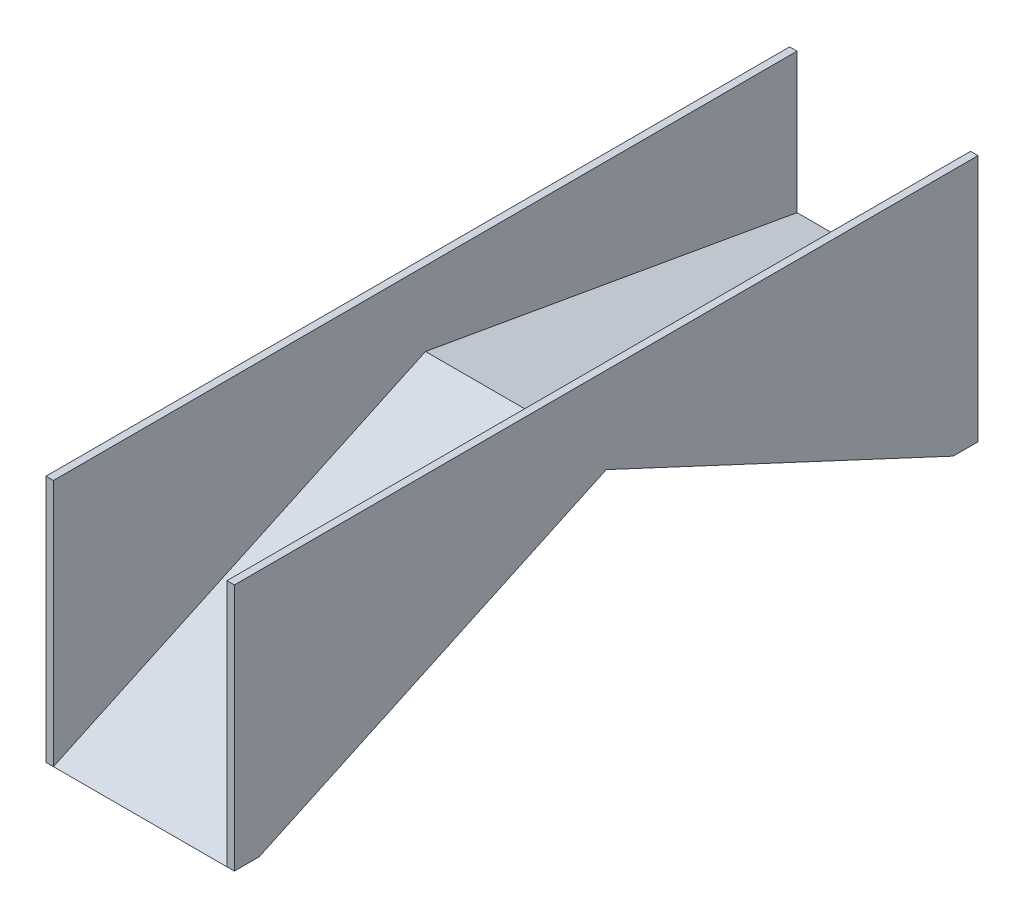
ISO-10303-21;
HEADER;
FILE_DESCRIPTION(('STEP AP214'),'2;1');
FILE_NAME('part.step','',(''),(''),'','','');
FILE_SCHEMA(('AUTOMOTIVE_DESIGN { 1 0 10303 214 1 1 1 1 }'));
ENDSEC;
DATA;
#1=APPLICATION_CONTEXT('core data for automotive mechanical design processes');
#2=APPLICATION_PROTOCOL_DEFINITION('international standard','automotive_design',2000,#1);
#3=PRODUCT_CONTEXT('',#1,'mechanical');
#4=PRODUCT('Part','Part','',(#3));
#5=PRODUCT_RELATED_PRODUCT_CATEGORY('part','',(#4));
#6=PRODUCT_DEFINITION_FORMATION('','',#4);
#7=PRODUCT_DEFINITION_CONTEXT('part definition',#1,'design');
#8=PRODUCT_DEFINITION('design','',#6,#7);
#9=PRODUCT_DEFINITION_SHAPE('','',#8);
#10=(LENGTH_UNIT() NAMED_UNIT(*) SI_UNIT(.MILLI.,.METRE.));
#11=(NAMED_UNIT(*) PLANE_ANGLE_UNIT() SI_UNIT($,.RADIAN.));
#12=(NAMED_UNIT(*) SI_UNIT($,.STERADIAN.) SOLID_ANGLE_UNIT());
#13=UNCERTAINTY_MEASURE_WITH_UNIT(LENGTH_MEASURE(1.E-05),#10,'distance_accuracy_value','');
#14=(GEOMETRIC_REPRESENTATION_CONTEXT(3) GLOBAL_UNCERTAINTY_ASSIGNED_CONTEXT((#13)) GLOBAL_UNIT_ASSIGNED_CONTEXT((#10,
#11,#12)) REPRESENTATION_CONTEXT('',''));
#15=CARTESIAN_POINT('',(0.,0.,0.));
#16=DIRECTION('',(0.,0.,1.));
#17=DIRECTION('',(1.,0.,0.));
#18=AXIS2_PLACEMENT_3D('',#15,#16,#17);
#19=CARTESIAN_POINT('',(0.,0.,0.));
#20=DIRECTION('',(0.,1.,0.));
#21=DIRECTION('',(0.,0.,1.));
#22=AXIS2_PLACEMENT_3D('',#19,#20,#21);
#23=PLANE('',#22);
#24=DIRECTION('',(0.,0.,1.));
#25=VECTOR('',#24,1.);
#26=CARTESIAN_POINT('',(-49.7317762400161,0.,0.));
#27=LINE('',#26,#25);
#28=CARTESIAN_POINT('',(-49.7317762400161,0.,151.723954719059));
#29=VERTEX_POINT('',#28);
#30=CARTESIAN_POINT('',(-49.731776240016,0.,161.723954719059));
#31=VERTEX_POINT('',#30);
#32=EDGE_CURVE('E234',#29,#31,#27,.T.);
#33=ORIENTED_EDGE('',*,*,#32,.F.);
#34=DIRECTION('',(1.,0.,0.));
#35=VECTOR('',#34,1.);
#36=CARTESIAN_POINT('',(-49.7317762400161,0.,151.723954719059));
#37=LINE('',#36,#35);
#38=CARTESIAN_POINT('',(26.2682237599839,0.,151.723954719059));
#39=VERTEX_POINT('',#38);
#40=EDGE_CURVE('E181',#29,#39,#37,.T.);
#41=ORIENTED_EDGE('',*,*,#40,.T.);
#42=DIRECTION('',(0.,0.,-1.));
#43=VECTOR('',#42,1.);
#44=CARTESIAN_POINT('',(26.2682237599839,0.,0.));
#45=LINE('',#44,#43);
#46=CARTESIAN_POINT('',(26.2682237599839,0.,161.723954719059));
#47=VERTEX_POINT('',#46);
#48=EDGE_CURVE('E214',#47,#39,#45,.T.);
#49=ORIENTED_EDGE('',*,*,#48,.F.);
#50=DIRECTION('',(1.,0.,0.));
#51=VECTOR('',#50,1.);
#52=CARTESIAN_POINT('',(0.,0.,161.723954719059));
#53=LINE('',#52,#51);
#54=CARTESIAN_POINT('',(23.2682237599839,0.,161.723954719059));
#55=VERTEX_POINT('',#54);
#56=EDGE_CURVE('E258',#55,#47,#53,.T.);
#57=ORIENTED_EDGE('',*,*,#56,.F.);
#58=DIRECTION('',(-1.,0.,0.));
#59=VECTOR('',#58,1.);
#60=CARTESIAN_POINT('',(188.902334580659,0.,161.723954719059));
#61=LINE('',#60,#59);
#62=CARTESIAN_POINT('',(-46.731776240016,0.,161.723954719059));
#63=VERTEX_POINT('',#62);
#64=EDGE_CURVE('E202',#55,#63,#61,.T.);
#65=ORIENTED_EDGE('',*,*,#64,.T.);
#66=EDGE_CURVE('E259',#31,#63,#53,.T.);
#67=ORIENTED_EDGE('',*,*,#66,.F.);
#68=EDGE_LOOP('',(#33,#41,#49,#57,#65,#67));
#69=FACE_BOUND('',#68,.T.);
#70=ADVANCED_FACE('F39',(#69),#23,.F.);
#71=CARTESIAN_POINT('',(0.,70.,-138.276045280941));
#72=DIRECTION('',(0.,0.,-1.));
#73=DIRECTION('',(-1.,0.,0.));
#74=AXIS2_PLACEMENT_3D('',#71,#72,#73);
#75=PLANE('',#74);
#76=DIRECTION('',(0.,-1.,0.));
#77=VECTOR('',#76,1.);
#78=CARTESIAN_POINT('',(-46.7317762400161,100.,-138.276045280941));
#79=LINE('',#78,#77);
#80=CARTESIAN_POINT('',(-46.7317762400161,100.,-138.276045280941));
#81=VERTEX_POINT('',#80);
#82=CARTESIAN_POINT('',(-46.7317762400161,43.5713159155916,-138.276045280941));
#83=VERTEX_POINT('',#82);
#84=EDGE_CURVE('E246',#81,#83,#79,.T.);
#85=ORIENTED_EDGE('',*,*,#84,.T.);
#86=DIRECTION('',(-1.,0.,0.));
#87=VECTOR('',#86,1.);
#88=CARTESIAN_POINT('',(175.464949573609,43.5713159155916,-138.276045280941));
#89=LINE('',#88,#87);
#90=CARTESIAN_POINT('',(23.2682237599839,43.5713159155916,-138.276045280941));
#91=VERTEX_POINT('',#90);
#92=EDGE_CURVE('E194',#91,#83,#89,.T.);
#93=ORIENTED_EDGE('',*,*,#92,.F.);
#94=DIRECTION('',(0.,-1.,0.));
#95=VECTOR('',#94,1.);
#96=CARTESIAN_POINT('',(23.2682237599839,100.,-138.276045280941));
#97=LINE('',#96,#95);
#98=CARTESIAN_POINT('',(23.2682237599839,100.,-138.276045280941));
#99=VERTEX_POINT('',#98);
#100=EDGE_CURVE('E226',#99,#91,#97,.T.);
#101=ORIENTED_EDGE('',*,*,#100,.F.);
#102=DIRECTION('',(1.,0.,0.));
#103=VECTOR('',#102,1.);
#104=CARTESIAN_POINT('',(0.,100.,-138.276045280941));
#105=LINE('',#104,#103);
#106=CARTESIAN_POINT('',(26.2682237599839,100.,-138.276045280941));
#107=VERTEX_POINT('',#106);
#108=EDGE_CURVE('E216',#99,#107,#105,.T.);
#109=ORIENTED_EDGE('',*,*,#108,.T.);
#110=DIRECTION('',(0.,-1.,0.));
#111=VECTOR('',#110,1.);
#112=CARTESIAN_POINT('',(26.2682237599839,100.,-138.276045280941));
#113=LINE('',#112,#111);
#114=CARTESIAN_POINT('',(26.2682237599839,0.,-138.276045280941));
#115=VERTEX_POINT('',#114);
#116=EDGE_CURVE('E228',#107,#115,#113,.T.);
#117=ORIENTED_EDGE('',*,*,#116,.T.);
#118=DIRECTION('',(1.,0.,0.));
#119=VECTOR('',#118,1.);
#120=CARTESIAN_POINT('',(0.,0.,-138.276045280941));
#121=LINE('',#120,#119);
#122=CARTESIAN_POINT('',(-49.7317762400161,0.,-138.276045280941));
#123=VERTEX_POINT('',#122);
#124=EDGE_CURVE('E262',#123,#115,#121,.T.);
#125=ORIENTED_EDGE('',*,*,#124,.F.);
#126=DIRECTION('',(0.,-1.,0.));
#127=VECTOR('',#126,1.);
#128=CARTESIAN_POINT('',(-49.7317762400161,100.,-138.276045280941));
#129=LINE('',#128,#127);
#130=CARTESIAN_POINT('',(-49.7317762400161,100.,-138.276045280941));
#131=VERTEX_POINT('',#130);
#132=EDGE_CURVE('E255',#131,#123,#129,.T.);
#133=ORIENTED_EDGE('',*,*,#132,.F.);
#134=DIRECTION('',(-1.,0.,0.));
#135=VECTOR('',#134,1.);
#136=CARTESIAN_POINT('',(0.,100.,-138.276045280941));
#137=LINE('',#136,#135);
#138=EDGE_CURVE('E235',#81,#131,#137,.T.);
#139=ORIENTED_EDGE('',*,*,#138,.F.);
#140=EDGE_LOOP('',(#85,#93,#101,#109,#117,#125,#133,#139));
#141=FACE_BOUND('',#140,.T.);
#142=ADVANCED_FACE('F286',(#141),#75,.T.);
#143=CARTESIAN_POINT('',(0.,70.,161.723954719059));
#144=DIRECTION('',(0.,0.,-1.));
#145=DIRECTION('',(-1.,0.,0.));
#146=AXIS2_PLACEMENT_3D('',#143,#144,#145);
#147=PLANE('',#146);
#148=DIRECTION('',(0.,-1.,0.));
#149=VECTOR('',#148,1.);
#150=CARTESIAN_POINT('',(23.2682237599839,100.,161.723954719059));
#151=LINE('',#150,#149);
#152=CARTESIAN_POINT('',(23.2682237599839,100.,161.723954719059));
#153=VERTEX_POINT('',#152);
#154=EDGE_CURVE('E222',#153,#55,#151,.T.);
#155=ORIENTED_EDGE('',*,*,#154,.T.);
#156=ORIENTED_EDGE('',*,*,#56,.T.);
#157=DIRECTION('',(0.,-1.,0.));
#158=VECTOR('',#157,1.);
#159=CARTESIAN_POINT('',(26.2682237599839,100.,161.723954719059));
#160=LINE('',#159,#158);
#161=CARTESIAN_POINT('',(26.2682237599839,100.,161.723954719059));
#162=VERTEX_POINT('',#161);
#163=EDGE_CURVE('E231',#162,#47,#160,.T.);
#164=ORIENTED_EDGE('',*,*,#163,.F.);
#165=DIRECTION('',(1.,0.,0.));
#166=VECTOR('',#165,1.);
#167=CARTESIAN_POINT('',(0.,100.,161.723954719059));
#168=LINE('',#167,#166);
#169=EDGE_CURVE('E210',#153,#162,#168,.T.);
#170=ORIENTED_EDGE('',*,*,#169,.F.);
#171=EDGE_LOOP('',(#155,#156,#164,#170));
#172=FACE_BOUND('',#171,.T.);
#173=ADVANCED_FACE('F300',(#172),#147,.F.);
#174=ORIENTED_EDGE('',*,*,#66,.T.);
#175=DIRECTION('',(0.,-1.,0.));
#176=VECTOR('',#175,1.);
#177=CARTESIAN_POINT('',(-46.731776240016,100.,161.723954719059));
#178=LINE('',#177,#176);
#179=CARTESIAN_POINT('',(-46.731776240016,100.,161.723954719059));
#180=VERTEX_POINT('',#179);
#181=EDGE_CURVE('E250',#180,#63,#178,.T.);
#182=ORIENTED_EDGE('',*,*,#181,.F.);
#183=DIRECTION('',(-1.,0.,0.));
#184=VECTOR('',#183,1.);
#185=CARTESIAN_POINT('',(0.,100.,161.723954719059));
#186=LINE('',#185,#184);
#187=CARTESIAN_POINT('',(-49.731776240016,100.,161.723954719059));
#188=VERTEX_POINT('',#187);
#189=EDGE_CURVE('E241',#180,#188,#186,.T.);
#190=ORIENTED_EDGE('',*,*,#189,.T.);
#191=DIRECTION('',(0.,-1.,0.));
#192=VECTOR('',#191,1.);
#193=CARTESIAN_POINT('',(-49.731776240016,100.,161.723954719059));
#194=LINE('',#193,#192);
#195=EDGE_CURVE('E252',#188,#31,#194,.T.);
#196=ORIENTED_EDGE('',*,*,#195,.T.);
#197=EDGE_LOOP('',(#174,#182,#190,#196));
#198=FACE_BOUND('',#197,.T.);
#199=ADVANCED_FACE('F41',(#198),#147,.F.);
#200=CARTESIAN_POINT('',(26.2682237599839,0.,-128.276045280941));
#201=VERTEX_POINT('',#200);
#202=EDGE_CURVE('E201',#201,#115,#45,.T.);
#203=ORIENTED_EDGE('',*,*,#202,.F.);
#204=DIRECTION('',(1.,0.,0.));
#205=VECTOR('',#204,1.);
#206=CARTESIAN_POINT('',(-49.7317762400161,0.,-128.276045280941));
#207=LINE('',#206,#205);
#208=CARTESIAN_POINT('',(13.2682237599839,0.,-128.276045280941));
#209=VERTEX_POINT('',#208);
#210=EDGE_CURVE('E62',#209,#201,#207,.T.);
#211=ORIENTED_EDGE('',*,*,#210,.F.);
#212=DIRECTION('',(1.,0.,0.));
#213=VECTOR('',#212,1.);
#214=CARTESIAN_POINT('',(-36.7317762400161,0.,-128.276045280941));
#215=LINE('',#214,#213);
#216=CARTESIAN_POINT('',(-36.7317762400161,0.,-128.276045280941));
#217=VERTEX_POINT('',#216);
#218=EDGE_CURVE('E157',#217,#209,#215,.T.);
#219=ORIENTED_EDGE('',*,*,#218,.F.);
#220=CARTESIAN_POINT('',(-49.7317762400161,0.,-128.276045280941));
#221=VERTEX_POINT('',#220);
#222=EDGE_CURVE('E187',#221,#217,#207,.T.);
#223=ORIENTED_EDGE('',*,*,#222,.F.);
#224=EDGE_CURVE('E239',#123,#221,#27,.T.);
#225=ORIENTED_EDGE('',*,*,#224,.F.);
#226=ORIENTED_EDGE('',*,*,#124,.T.);
#227=EDGE_LOOP('',(#203,#211,#219,#223,#225,#226));
#228=FACE_BOUND('',#227,.T.);
#229=ADVANCED_FACE('F269',(#228),#23,.F.);
#230=CARTESIAN_POINT('',(-46.731776240016,100.,0.));
#231=DIRECTION('',(-1.,0.,0.));
#232=DIRECTION('',(0.,0.,1.));
#233=AXIS2_PLACEMENT_3D('',#230,#231,#232);
#234=PLANE('',#233);
#235=ORIENTED_EDGE('',*,*,#181,.T.);
#236=DIRECTION('',(0.,-0.4226182617407,0.90630778703665));
#237=VECTOR('',#236,1.);
#238=CARTESIAN_POINT('',(-46.731776240016,61.9438684158803,28.8849002180706));
#239=LINE('',#238,#237);
#240=CARTESIAN_POINT('',(-46.731776240016,70.,11.6084702833903));
#241=VERTEX_POINT('',#240);
#242=EDGE_CURVE('E193',#241,#63,#239,.T.);
#243=ORIENTED_EDGE('',*,*,#242,.F.);
#244=DIRECTION('',(0.,0.173648177666924,0.984807753012209));
#245=VECTOR('',#244,1.);
#246=CARTESIAN_POINT('',(-46.7317762400161,43.5713159155916,-138.276045280941));
#247=LINE('',#246,#245);
#248=EDGE_CURVE('E184',#83,#241,#247,.T.);
#249=ORIENTED_EDGE('',*,*,#248,.F.);
#250=ORIENTED_EDGE('',*,*,#84,.F.);
#251=DIRECTION('',(0.,0.,-1.));
#252=VECTOR('',#251,1.);
#253=CARTESIAN_POINT('',(-46.731776240016,100.,0.));
#254=LINE('',#253,#252);
#255=EDGE_CURVE('E244',#180,#81,#254,.T.);
#256=ORIENTED_EDGE('',*,*,#255,.F.);
#257=EDGE_LOOP('',(#235,#243,#249,#250,#256));
#258=FACE_BOUND('',#257,.T.);
#259=ADVANCED_FACE('F312',(#258),#234,.F.);
#260=CARTESIAN_POINT('',(-49.7317762400161,100.,0.));
#261=DIRECTION('',(1.,0.,0.));
#262=DIRECTION('',(0.,0.,-1.));
#263=AXIS2_PLACEMENT_3D('',#260,#261,#262);
#264=PLANE('',#263);
#265=DIRECTION('',(0.,0.422618261740701,0.906307787036649));
#266=VECTOR('',#265,1.);
#267=CARTESIAN_POINT('',(-49.7317762400161,65.2830721417001,11.723954719059));
#268=LINE('',#267,#266);
#269=CARTESIAN_POINT('',(-49.7317762400161,65.2830721417001,11.723954719059));
#270=VERTEX_POINT('',#269);
#271=EDGE_CURVE('E172',#221,#270,#268,.T.);
#272=ORIENTED_EDGE('',*,*,#271,.T.);
#273=DIRECTION('',(0.,-0.422618261740701,0.906307787036649));
#274=VECTOR('',#273,1.);
#275=CARTESIAN_POINT('',(-49.7317762400161,0.,151.723954719059));
#276=LINE('',#275,#274);
#277=EDGE_CURVE('E175',#270,#29,#276,.T.);
#278=ORIENTED_EDGE('',*,*,#277,.T.);
#279=ORIENTED_EDGE('',*,*,#32,.T.);
#280=ORIENTED_EDGE('',*,*,#195,.F.);
#281=DIRECTION('',(0.,0.,1.));
#282=VECTOR('',#281,1.);
#283=CARTESIAN_POINT('',(-49.7317762400161,100.,0.));
#284=LINE('',#283,#282);
#285=EDGE_CURVE('E238',#131,#188,#284,.T.);
#286=ORIENTED_EDGE('',*,*,#285,.F.);
#287=ORIENTED_EDGE('',*,*,#132,.T.);
#288=ORIENTED_EDGE('',*,*,#224,.T.);
#289=EDGE_LOOP('',(#272,#278,#279,#280,#286,#287,#288));
#290=FACE_BOUND('',#289,.T.);
#291=ADVANCED_FACE('F281',(#290),#264,.F.);
#292=CARTESIAN_POINT('',(0.,100.,0.));
#293=DIRECTION('',(0.,1.,0.));
#294=DIRECTION('',(0.,0.,1.));
#295=AXIS2_PLACEMENT_3D('',#292,#293,#294);
#296=PLANE('',#295);
#297=ORIENTED_EDGE('',*,*,#138,.T.);
#298=ORIENTED_EDGE('',*,*,#285,.T.);
#299=ORIENTED_EDGE('',*,*,#189,.F.);
#300=ORIENTED_EDGE('',*,*,#255,.T.);
#301=EDGE_LOOP('',(#297,#298,#299,#300));
#302=FACE_BOUND('',#301,.T.);
#303=ADVANCED_FACE('F308',(#302),#296,.T.);
#304=CARTESIAN_POINT('',(23.2682237599839,100.,0.));
#305=DIRECTION('',(-1.,0.,0.));
#306=DIRECTION('',(0.,0.,1.));
#307=AXIS2_PLACEMENT_3D('',#304,#305,#306);
#308=PLANE('',#307);
#309=ORIENTED_EDGE('',*,*,#100,.T.);
#310=DIRECTION('',(0.,-0.173648177666924,-0.984807753012209));
#311=VECTOR('',#310,1.);
#312=CARTESIAN_POINT('',(23.2682237599839,43.5713159155916,-138.276045280941));
#313=LINE('',#312,#311);
#314=CARTESIAN_POINT('',(23.2682237599839,70.,11.6084702833902));
#315=VERTEX_POINT('',#314);
#316=EDGE_CURVE('E190',#315,#91,#313,.T.);
#317=ORIENTED_EDGE('',*,*,#316,.F.);
#318=DIRECTION('',(0.,0.4226182617407,-0.90630778703665));
#319=VECTOR('',#318,1.);
#320=CARTESIAN_POINT('',(23.2682237599839,61.9438684158803,28.8849002180706));
#321=LINE('',#320,#319);
#322=EDGE_CURVE('E198',#55,#315,#321,.T.);
#323=ORIENTED_EDGE('',*,*,#322,.F.);
#324=ORIENTED_EDGE('',*,*,#154,.F.);
#325=DIRECTION('',(0.,0.,-1.));
#326=VECTOR('',#325,1.);
#327=CARTESIAN_POINT('',(23.2682237599839,100.,0.));
#328=LINE('',#327,#326);
#329=EDGE_CURVE('E219',#153,#99,#328,.T.);
#330=ORIENTED_EDGE('',*,*,#329,.T.);
#331=EDGE_LOOP('',(#309,#317,#323,#324,#330));
#332=FACE_BOUND('',#331,.T.);
#333=ADVANCED_FACE('F293',(#332),#308,.T.);
#334=CARTESIAN_POINT('',(26.2682237599839,100.,0.));
#335=DIRECTION('',(-1.,0.,0.));
#336=DIRECTION('',(0.,0.,1.));
#337=AXIS2_PLACEMENT_3D('',#334,#335,#336);
#338=PLANE('',#337);
#339=ORIENTED_EDGE('',*,*,#48,.T.);
#340=DIRECTION('',(0.,-0.422618261740701,0.906307787036649));
#341=VECTOR('',#340,1.);
#342=CARTESIAN_POINT('',(26.2682237599839,0.,151.723954719059));
#343=LINE('',#342,#341);
#344=CARTESIAN_POINT('',(26.2682237599839,65.2830721417001,11.723954719059));
#345=VERTEX_POINT('',#344);
#346=EDGE_CURVE('E176',#345,#39,#343,.T.);
#347=ORIENTED_EDGE('',*,*,#346,.F.);
#348=DIRECTION('',(0.,0.422618261740701,0.906307787036649));
#349=VECTOR('',#348,1.);
#350=CARTESIAN_POINT('',(26.2682237599839,65.2830721417001,11.723954719059));
#351=LINE('',#350,#349);
#352=EDGE_CURVE('E170',#201,#345,#351,.T.);
#353=ORIENTED_EDGE('',*,*,#352,.F.);
#354=ORIENTED_EDGE('',*,*,#202,.T.);
#355=ORIENTED_EDGE('',*,*,#116,.F.);
#356=DIRECTION('',(0.,0.,-1.));
#357=VECTOR('',#356,1.);
#358=CARTESIAN_POINT('',(26.2682237599839,100.,0.));
#359=LINE('',#358,#357);
#360=EDGE_CURVE('E213',#162,#107,#359,.T.);
#361=ORIENTED_EDGE('',*,*,#360,.F.);
#362=ORIENTED_EDGE('',*,*,#163,.T.);
#363=EDGE_LOOP('',(#339,#347,#353,#354,#355,#361,#362));
#364=FACE_BOUND('',#363,.T.);
#365=ADVANCED_FACE('F274',(#364),#338,.F.);
#366=CARTESIAN_POINT('',(0.,100.,0.));
#367=DIRECTION('',(0.,1.,0.));
#368=DIRECTION('',(0.,0.,1.));
#369=AXIS2_PLACEMENT_3D('',#366,#367,#368);
#370=PLANE('',#369);
#371=ORIENTED_EDGE('',*,*,#169,.T.);
#372=ORIENTED_EDGE('',*,*,#360,.T.);
#373=ORIENTED_EDGE('',*,*,#108,.F.);
#374=ORIENTED_EDGE('',*,*,#329,.F.);
#375=EDGE_LOOP('',(#371,#372,#373,#374));
#376=FACE_BOUND('',#375,.T.);
#377=ADVANCED_FACE('F291',(#376),#370,.T.);
#378=CARTESIAN_POINT('',(188.902334580659,61.9438684158803,28.8849002180706));
#379=DIRECTION('',(0.,-0.906307787036649,-0.4226182617407));
#380=DIRECTION('',(0.,0.4226182617407,-0.90630778703665));
#381=AXIS2_PLACEMENT_3D('',#378,#379,#380);
#382=PLANE('',#381);
#383=ORIENTED_EDGE('',*,*,#322,.T.);
#384=DIRECTION('',(-1.,0.,0.));
#385=VECTOR('',#384,1.);
#386=CARTESIAN_POINT('',(188.902334580659,70.,11.6084702833902));
#387=LINE('',#386,#385);
#388=EDGE_CURVE('E205',#315,#241,#387,.T.);
#389=ORIENTED_EDGE('',*,*,#388,.T.);
#390=ORIENTED_EDGE('',*,*,#242,.T.);
#391=ORIENTED_EDGE('',*,*,#64,.F.);
#392=EDGE_LOOP('',(#383,#389,#390,#391));
#393=FACE_BOUND('',#392,.T.);
#394=ADVANCED_FACE('F318',(#393),#382,.F.);
#395=CARTESIAN_POINT('',(175.464949573609,43.5713159155916,-138.276045280941));
#396=DIRECTION('',(0.,-0.984807753012209,0.173648177666924));
#397=DIRECTION('',(0.,-0.173648177666924,-0.984807753012209));
#398=AXIS2_PLACEMENT_3D('',#395,#396,#397);
#399=PLANE('',#398);
#400=ORIENTED_EDGE('',*,*,#316,.T.);
#401=ORIENTED_EDGE('',*,*,#92,.T.);
#402=ORIENTED_EDGE('',*,*,#248,.T.);
#403=ORIENTED_EDGE('',*,*,#388,.F.);
#404=EDGE_LOOP('',(#400,#401,#402,#403));
#405=FACE_BOUND('',#404,.T.);
#406=ADVANCED_FACE('F315',(#405),#399,.F.);
#407=CARTESIAN_POINT('',(-49.7317762400161,0.,151.723954719059));
#408=DIRECTION('',(0.,0.906307787036649,0.422618261740701));
#409=DIRECTION('',(0.,-0.422618261740701,0.906307787036649));
#410=AXIS2_PLACEMENT_3D('',#407,#408,#409);
#411=PLANE('',#410);
#412=ORIENTED_EDGE('',*,*,#346,.T.);
#413=ORIENTED_EDGE('',*,*,#40,.F.);
#414=ORIENTED_EDGE('',*,*,#277,.F.);
#415=DIRECTION('',(1.,0.,0.));
#416=VECTOR('',#415,1.);
#417=CARTESIAN_POINT('',(-49.7317762400161,65.2830721417001,11.723954719059));
#418=LINE('',#417,#416);
#419=EDGE_CURVE('E185',#270,#345,#418,.T.);
#420=ORIENTED_EDGE('',*,*,#419,.T.);
#421=EDGE_LOOP('',(#412,#413,#414,#420));
#422=FACE_BOUND('',#421,.T.);
#423=ADVANCED_FACE('F278',(#422),#411,.F.);
#424=CARTESIAN_POINT('',(-49.7317762400161,65.2830721417001,11.723954719059));
#425=DIRECTION('',(0.,0.906307787036649,-0.422618261740701));
#426=DIRECTION('',(0.,0.422618261740701,0.906307787036649));
#427=AXIS2_PLACEMENT_3D('',#424,#425,#426);
#428=PLANE('',#427);
#429=ORIENTED_EDGE('',*,*,#222,.T.);
#430=DIRECTION('',(0.,0.422618261740701,0.906307787036649));
#431=VECTOR('',#430,1.);
#432=CARTESIAN_POINT('',(-36.7317762400161,65.2830721417001,11.723954719059));
#433=LINE('',#432,#431);
#434=CARTESIAN_POINT('',(-36.7317762400161,30.,-63.9408376656545));
#435=VERTEX_POINT('',#434);
#436=EDGE_CURVE('E11',#217,#435,#433,.T.);
#437=ORIENTED_EDGE('',*,*,#436,.T.);
#438=DIRECTION('',(1.,0.,0.));
#439=VECTOR('',#438,1.);
#440=CARTESIAN_POINT('',(-49.7317762400161,30.,-63.9408376656545));
#441=LINE('',#440,#439);
#442=CARTESIAN_POINT('',(13.2682237599839,30.,-63.9408376656545));
#443=VERTEX_POINT('',#442);
#444=EDGE_CURVE('E155',#435,#443,#441,.T.);
#445=ORIENTED_EDGE('',*,*,#444,.T.);
#446=DIRECTION('',(0.,-0.422618261740701,-0.906307787036649));
#447=VECTOR('',#446,1.);
#448=CARTESIAN_POINT('',(13.2682237599839,65.2830721417001,11.723954719059));
#449=LINE('',#448,#447);
#450=EDGE_CURVE('E47',#443,#209,#449,.T.);
#451=ORIENTED_EDGE('',*,*,#450,.T.);
#452=ORIENTED_EDGE('',*,*,#210,.T.);
#453=ORIENTED_EDGE('',*,*,#352,.T.);
#454=ORIENTED_EDGE('',*,*,#419,.F.);
#455=ORIENTED_EDGE('',*,*,#271,.F.);
#456=EDGE_LOOP('',(#429,#437,#445,#451,#452,#453,#454,#455));
#457=FACE_BOUND('',#456,.T.);
#458=ADVANCED_FACE('F265',(#457),#428,.F.);
#459=CARTESIAN_POINT('',(-36.7317762400161,30.,-128.276045280941));
#460=DIRECTION('',(-1.,0.,0.));
#461=DIRECTION('',(0.,0.,1.));
#462=AXIS2_PLACEMENT_3D('',#459,#460,#461);
#463=PLANE('',#462);
#464=DIRECTION('',(0.,-1.,0.));
#465=VECTOR('',#464,1.);
#466=CARTESIAN_POINT('',(-36.7317762400161,30.,-128.276045280941));
#467=LINE('',#466,#465);
#468=CARTESIAN_POINT('',(-36.7317762400161,30.,-128.276045280941));
#469=VERTEX_POINT('',#468);
#470=EDGE_CURVE('E54',#469,#217,#467,.T.);
#471=ORIENTED_EDGE('',*,*,#470,.F.);
#472=DIRECTION('',(0.,0.,-1.));
#473=VECTOR('',#472,1.);
#474=CARTESIAN_POINT('',(-36.7317762400161,30.,-128.276045280941));
#475=LINE('',#474,#473);
#476=EDGE_CURVE('E150',#435,#469,#475,.T.);
#477=ORIENTED_EDGE('',*,*,#476,.F.);
#478=ORIENTED_EDGE('',*,*,#436,.F.);
#479=EDGE_LOOP('',(#471,#477,#478));
#480=FACE_BOUND('',#479,.T.);
#481=ADVANCED_FACE('F159',(#480),#463,.F.);
#482=CARTESIAN_POINT('',(13.2682237599839,30.,-128.276045280941));
#483=DIRECTION('',(1.,0.,0.));
#484=DIRECTION('',(0.,0.,-1.));
#485=AXIS2_PLACEMENT_3D('',#482,#483,#484);
#486=PLANE('',#485);
#487=DIRECTION('',(0.,0.,1.));
#488=VECTOR('',#487,1.);
#489=CARTESIAN_POINT('',(13.2682237599839,30.,-128.276045280941));
#490=LINE('',#489,#488);
#491=CARTESIAN_POINT('',(13.2682237599839,30.,-128.276045280941));
#492=VERTEX_POINT('',#491);
#493=EDGE_CURVE('E162',#492,#443,#490,.T.);
#494=ORIENTED_EDGE('',*,*,#493,.F.);
#495=DIRECTION('',(0.,-1.,0.));
#496=VECTOR('',#495,1.);
#497=CARTESIAN_POINT('',(13.2682237599839,30.,-128.276045280941));
#498=LINE('',#497,#496);
#499=EDGE_CURVE('E161',#492,#209,#498,.T.);
#500=ORIENTED_EDGE('',*,*,#499,.T.);
#501=ORIENTED_EDGE('',*,*,#450,.F.);
#502=EDGE_LOOP('',(#494,#500,#501));
#503=FACE_BOUND('',#502,.T.);
#504=ADVANCED_FACE('F440',(#503),#486,.F.);
#505=CARTESIAN_POINT('',(0.,30.,0.));
#506=DIRECTION('',(0.,1.,0.));
#507=DIRECTION('',(0.,0.,1.));
#508=AXIS2_PLACEMENT_3D('',#505,#506,#507);
#509=PLANE('',#508);
#510=ORIENTED_EDGE('',*,*,#476,.T.);
#511=DIRECTION('',(1.,0.,0.));
#512=VECTOR('',#511,1.);
#513=CARTESIAN_POINT('',(-36.7317762400161,30.,-128.276045280941));
#514=LINE('',#513,#512);
#515=EDGE_CURVE('E153',#469,#492,#514,.T.);
#516=ORIENTED_EDGE('',*,*,#515,.T.);
#517=ORIENTED_EDGE('',*,*,#493,.T.);
#518=ORIENTED_EDGE('',*,*,#444,.F.);
#519=EDGE_LOOP('',(#510,#516,#517,#518));
#520=FACE_BOUND('',#519,.T.);
#521=ADVANCED_FACE('F151',(#520),#509,.F.);
#522=CARTESIAN_POINT('',(-36.7317762400161,30.,-128.276045280941));
#523=DIRECTION('',(0.,0.,-1.));
#524=DIRECTION('',(-1.,0.,0.));
#525=AXIS2_PLACEMENT_3D('',#522,#523,#524);
#526=PLANE('',#525);
#527=ORIENTED_EDGE('',*,*,#218,.T.);
#528=ORIENTED_EDGE('',*,*,#499,.F.);
#529=ORIENTED_EDGE('',*,*,#515,.F.);
#530=ORIENTED_EDGE('',*,*,#470,.T.);
#531=EDGE_LOOP('',(#527,#528,#529,#530));
#532=FACE_BOUND('',#531,.T.);
#533=ADVANCED_FACE('F164',(#532),#526,.F.);
#534=CLOSED_SHELL('',(#70,#142,#173,#199,#229,#259,#291,#303,#333,#365,#377,#394,#406,#423,#458,
#481,#504,#521,#533));
#535=MANIFOLD_SOLID_BREP('B2',#534);
#536=ADVANCED_BREP_SHAPE_REPRESENTATION('',(#18,#535),#14);
#537=SHAPE_DEFINITION_REPRESENTATION(#9,#536);
ENDSEC;
END-ISO-10303-21;
